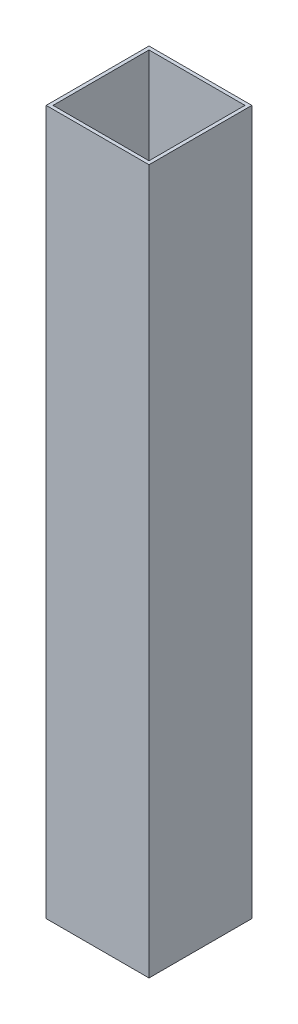
ISO-10303-21;
HEADER;
FILE_DESCRIPTION(('STEP AP214'),'2;1');
FILE_NAME('part.step','',(''),(''),'','','');
FILE_SCHEMA(('AUTOMOTIVE_DESIGN { 1 0 10303 214 1 1 1 1 }'));
ENDSEC;
DATA;
#1=APPLICATION_CONTEXT('core data for automotive mechanical design processes');
#2=APPLICATION_PROTOCOL_DEFINITION('international standard','automotive_design',2000,#1);
#3=PRODUCT_CONTEXT('',#1,'mechanical');
#4=PRODUCT('Part','Part','',(#3));
#5=PRODUCT_RELATED_PRODUCT_CATEGORY('part','',(#4));
#6=PRODUCT_DEFINITION_FORMATION('','',#4);
#7=PRODUCT_DEFINITION_CONTEXT('part definition',#1,'design');
#8=PRODUCT_DEFINITION('design','',#6,#7);
#9=PRODUCT_DEFINITION_SHAPE('','',#8);
#10=(LENGTH_UNIT() NAMED_UNIT(*) SI_UNIT(.MILLI.,.METRE.));
#11=(NAMED_UNIT(*) PLANE_ANGLE_UNIT() SI_UNIT($,.RADIAN.));
#12=(NAMED_UNIT(*) SI_UNIT($,.STERADIAN.) SOLID_ANGLE_UNIT());
#13=UNCERTAINTY_MEASURE_WITH_UNIT(LENGTH_MEASURE(1.E-05),#10,'distance_accuracy_value','');
#14=(GEOMETRIC_REPRESENTATION_CONTEXT(3) GLOBAL_UNCERTAINTY_ASSIGNED_CONTEXT((#13)) GLOBAL_UNIT_ASSIGNED_CONTEXT((#10,
#11,#12)) REPRESENTATION_CONTEXT('',''));
#15=CARTESIAN_POINT('',(0.,0.,0.));
#16=DIRECTION('',(0.,0.,1.));
#17=DIRECTION('',(1.,0.,0.));
#18=AXIS2_PLACEMENT_3D('',#15,#16,#17);
#19=CARTESIAN_POINT('',(0.,440.,-30.));
#20=DIRECTION('',(0.,1.,0.));
#21=DIRECTION('',(0.,0.,1.));
#22=AXIS2_PLACEMENT_3D('',#19,#20,#21);
#23=PLANE('',#22);
#24=DIRECTION('',(0.,0.,1.));
#25=VECTOR('',#24,1.);
#26=CARTESIAN_POINT('',(29.0000000000002,440.,0.));
#27=LINE('',#26,#25);
#28=CARTESIAN_POINT('',(29.0000000000002,440.,0.));
#29=VERTEX_POINT('',#28);
#30=CARTESIAN_POINT('',(29.0000000000002,440.,60.));
#31=VERTEX_POINT('',#30);
#32=EDGE_CURVE('E110',#29,#31,#27,.T.);
#33=ORIENTED_EDGE('',*,*,#32,.F.);
#34=DIRECTION('',(1.,0.,0.));
#35=VECTOR('',#34,1.);
#36=CARTESIAN_POINT('',(-30.9999999999998,440.,0.));
#37=LINE('',#36,#35);
#38=CARTESIAN_POINT('',(-30.9999999999998,440.,0.));
#39=VERTEX_POINT('',#38);
#40=EDGE_CURVE('E139',#39,#29,#37,.T.);
#41=ORIENTED_EDGE('',*,*,#40,.F.);
#42=DIRECTION('',(0.,0.,-1.));
#43=VECTOR('',#42,1.);
#44=CARTESIAN_POINT('',(-30.9999999999998,440.,0.));
#45=LINE('',#44,#43);
#46=CARTESIAN_POINT('',(-30.9999999999998,440.,60.));
#47=VERTEX_POINT('',#46);
#48=EDGE_CURVE('E134',#47,#39,#45,.T.);
#49=ORIENTED_EDGE('',*,*,#48,.F.);
#50=DIRECTION('',(-1.,0.,0.));
#51=VECTOR('',#50,1.);
#52=CARTESIAN_POINT('',(-30.9999999999998,440.,60.));
#53=LINE('',#52,#51);
#54=EDGE_CURVE('E129',#31,#47,#53,.T.);
#55=ORIENTED_EDGE('',*,*,#54,.F.);
#56=EDGE_LOOP('',(#33,#41,#49,#55));
#57=FACE_BOUND('',#56,.T.);
#58=DIRECTION('',(0.,0.,1.));
#59=VECTOR('',#58,1.);
#60=CARTESIAN_POINT('',(27.0000000000002,440.,2.00000000000002));
#61=LINE('',#60,#59);
#62=CARTESIAN_POINT('',(27.0000000000002,440.,2.00000000000002));
#63=VERTEX_POINT('',#62);
#64=CARTESIAN_POINT('',(27.0000000000002,440.,58.));
#65=VERTEX_POINT('',#64);
#66=EDGE_CURVE('E74',#63,#65,#61,.T.);
#67=ORIENTED_EDGE('',*,*,#66,.T.);
#68=DIRECTION('',(-1.,0.,0.));
#69=VECTOR('',#68,1.);
#70=CARTESIAN_POINT('',(-28.9999999999998,440.,58.));
#71=LINE('',#70,#69);
#72=CARTESIAN_POINT('',(-28.9999999999998,440.,58.));
#73=VERTEX_POINT('',#72);
#74=EDGE_CURVE('E76',#65,#73,#71,.T.);
#75=ORIENTED_EDGE('',*,*,#74,.T.);
#76=DIRECTION('',(0.,0.,-1.));
#77=VECTOR('',#76,1.);
#78=CARTESIAN_POINT('',(-28.9999999999998,440.,2.00000000000002));
#79=LINE('',#78,#77);
#80=CARTESIAN_POINT('',(-28.9999999999998,440.,2.00000000000002));
#81=VERTEX_POINT('',#80);
#82=EDGE_CURVE('E94',#73,#81,#79,.T.);
#83=ORIENTED_EDGE('',*,*,#82,.T.);
#84=DIRECTION('',(1.,0.,0.));
#85=VECTOR('',#84,1.);
#86=CARTESIAN_POINT('',(-28.9999999999998,440.,2.00000000000002));
#87=LINE('',#86,#85);
#88=EDGE_CURVE('E78',#81,#63,#87,.T.);
#89=ORIENTED_EDGE('',*,*,#88,.T.);
#90=EDGE_LOOP('',(#67,#75,#83,#89));
#91=FACE_BOUND('',#90,.T.);
#92=ADVANCED_FACE('F19',(#57,#91),#23,.T.);
#93=CARTESIAN_POINT('',(29.0000000000002,-440.,0.));
#94=DIRECTION('',(-1.,0.,0.));
#95=DIRECTION('',(0.,0.,1.));
#96=AXIS2_PLACEMENT_3D('',#93,#94,#95);
#97=PLANE('',#96);
#98=ORIENTED_EDGE('',*,*,#32,.T.);
#99=DIRECTION('',(0.,1.,0.));
#100=VECTOR('',#99,1.);
#101=CARTESIAN_POINT('',(29.0000000000002,-440.,60.));
#102=LINE('',#101,#100);
#103=CARTESIAN_POINT('',(29.0000000000002,29.0000000000001,60.));
#104=VERTEX_POINT('',#103);
#105=EDGE_CURVE('E131',#104,#31,#102,.T.);
#106=ORIENTED_EDGE('',*,*,#105,.F.);
#107=DIRECTION('',(0.,0.,-1.));
#108=VECTOR('',#107,1.);
#109=CARTESIAN_POINT('',(29.0000000000002,29.0000000000001,0.));
#110=LINE('',#109,#108);
#111=CARTESIAN_POINT('',(29.0000000000002,29.0000000000001,0.));
#112=VERTEX_POINT('',#111);
#113=EDGE_CURVE('E130',#104,#112,#110,.T.);
#114=ORIENTED_EDGE('',*,*,#113,.T.);
#115=DIRECTION('',(0.,1.,0.));
#116=VECTOR('',#115,1.);
#117=CARTESIAN_POINT('',(29.0000000000002,-440.,0.));
#118=LINE('',#117,#116);
#119=EDGE_CURVE('E125',#112,#29,#118,.T.);
#120=ORIENTED_EDGE('',*,*,#119,.T.);
#121=EDGE_LOOP('',(#98,#106,#114,#120));
#122=FACE_BOUND('',#121,.T.);
#123=ADVANCED_FACE('F181',(#122),#97,.F.);
#124=CARTESIAN_POINT('',(-30.9999999999998,-440.,60.));
#125=DIRECTION('',(0.,0.,-1.));
#126=DIRECTION('',(-1.,0.,0.));
#127=AXIS2_PLACEMENT_3D('',#124,#125,#126);
#128=PLANE('',#127);
#129=ORIENTED_EDGE('',*,*,#54,.T.);
#130=DIRECTION('',(0.,1.,0.));
#131=VECTOR('',#130,1.);
#132=CARTESIAN_POINT('',(-30.9999999999998,-440.,60.));
#133=LINE('',#132,#131);
#134=CARTESIAN_POINT('',(-30.9999999999998,29.0000000000001,60.));
#135=VERTEX_POINT('',#134);
#136=EDGE_CURVE('E136',#135,#47,#133,.T.);
#137=ORIENTED_EDGE('',*,*,#136,.F.);
#138=DIRECTION('',(1.,0.,0.));
#139=VECTOR('',#138,1.);
#140=CARTESIAN_POINT('',(-30.9999999999998,29.0000000000001,60.));
#141=LINE('',#140,#139);
#142=EDGE_CURVE('E135',#135,#104,#141,.T.);
#143=ORIENTED_EDGE('',*,*,#142,.T.);
#144=ORIENTED_EDGE('',*,*,#105,.T.);
#145=EDGE_LOOP('',(#129,#137,#143,#144));
#146=FACE_BOUND('',#145,.T.);
#147=ADVANCED_FACE('F176',(#146),#128,.F.);
#148=CARTESIAN_POINT('',(-30.9999999999998,-440.,0.));
#149=DIRECTION('',(1.,0.,0.));
#150=DIRECTION('',(0.,0.,-1.));
#151=AXIS2_PLACEMENT_3D('',#148,#149,#150);
#152=PLANE('',#151);
#153=ORIENTED_EDGE('',*,*,#48,.T.);
#154=DIRECTION('',(0.,1.,0.));
#155=VECTOR('',#154,1.);
#156=CARTESIAN_POINT('',(-30.9999999999998,-440.,0.));
#157=LINE('',#156,#155);
#158=CARTESIAN_POINT('',(-30.9999999999998,29.0000000000001,0.));
#159=VERTEX_POINT('',#158);
#160=EDGE_CURVE('E23',#159,#39,#157,.T.);
#161=ORIENTED_EDGE('',*,*,#160,.F.);
#162=DIRECTION('',(0.,0.,1.));
#163=VECTOR('',#162,1.);
#164=CARTESIAN_POINT('',(-30.9999999999998,29.0000000000001,0.));
#165=LINE('',#164,#163);
#166=EDGE_CURVE('E140',#159,#135,#165,.T.);
#167=ORIENTED_EDGE('',*,*,#166,.T.);
#168=ORIENTED_EDGE('',*,*,#136,.T.);
#169=EDGE_LOOP('',(#153,#161,#167,#168));
#170=FACE_BOUND('',#169,.T.);
#171=ADVANCED_FACE('F190',(#170),#152,.F.);
#172=CARTESIAN_POINT('',(-30.9999999999998,-440.,0.));
#173=DIRECTION('',(0.,0.,1.));
#174=DIRECTION('',(1.,0.,0.));
#175=AXIS2_PLACEMENT_3D('',#172,#173,#174);
#176=PLANE('',#175);
#177=ORIENTED_EDGE('',*,*,#40,.T.);
#178=ORIENTED_EDGE('',*,*,#119,.F.);
#179=DIRECTION('',(-1.,0.,0.));
#180=VECTOR('',#179,1.);
#181=CARTESIAN_POINT('',(-30.9999999999998,29.0000000000001,0.));
#182=LINE('',#181,#180);
#183=EDGE_CURVE('E39',#112,#159,#182,.T.);
#184=ORIENTED_EDGE('',*,*,#183,.T.);
#185=ORIENTED_EDGE('',*,*,#160,.T.);
#186=EDGE_LOOP('',(#177,#178,#184,#185));
#187=FACE_BOUND('',#186,.T.);
#188=ADVANCED_FACE('F194',(#187),#176,.F.);
#189=CARTESIAN_POINT('',(1.11022302462516E-13,29.0000000000001,30.));
#190=DIRECTION('',(0.,1.,0.));
#191=DIRECTION('',(-1.,0.,0.));
#192=AXIS2_PLACEMENT_3D('',#189,#190,#191);
#193=PLANE('',#192);
#194=DIRECTION('',(1.,0.,0.));
#195=VECTOR('',#194,1.);
#196=CARTESIAN_POINT('',(-28.9999999999998,29.0000000000001,58.));
#197=LINE('',#196,#195);
#198=CARTESIAN_POINT('',(-28.9999999999998,29.0000000000001,58.));
#199=VERTEX_POINT('',#198);
#200=CARTESIAN_POINT('',(27.0000000000002,29.0000000000001,58.));
#201=VERTEX_POINT('',#200);
#202=EDGE_CURVE('E163',#199,#201,#197,.T.);
#203=ORIENTED_EDGE('',*,*,#202,.T.);
#204=DIRECTION('',(0.,0.,-1.));
#205=VECTOR('',#204,1.);
#206=CARTESIAN_POINT('',(27.0000000000002,29.0000000000001,2.00000000000002));
#207=LINE('',#206,#205);
#208=CARTESIAN_POINT('',(27.0000000000002,29.0000000000001,2.00000000000002));
#209=VERTEX_POINT('',#208);
#210=EDGE_CURVE('E97',#201,#209,#207,.T.);
#211=ORIENTED_EDGE('',*,*,#210,.T.);
#212=DIRECTION('',(-1.,0.,0.));
#213=VECTOR('',#212,1.);
#214=CARTESIAN_POINT('',(-28.9999999999998,29.0000000000001,2.00000000000002));
#215=LINE('',#214,#213);
#216=CARTESIAN_POINT('',(-28.9999999999998,29.0000000000001,2.00000000000002));
#217=VERTEX_POINT('',#216);
#218=EDGE_CURVE('E106',#209,#217,#215,.T.);
#219=ORIENTED_EDGE('',*,*,#218,.T.);
#220=DIRECTION('',(0.,0.,1.));
#221=VECTOR('',#220,1.);
#222=CARTESIAN_POINT('',(-28.9999999999998,29.0000000000001,2.00000000000002));
#223=LINE('',#222,#221);
#224=EDGE_CURVE('E100',#217,#199,#223,.T.);
#225=ORIENTED_EDGE('',*,*,#224,.T.);
#226=EDGE_LOOP('',(#203,#211,#219,#225));
#227=FACE_BOUND('',#226,.T.);
#228=ORIENTED_EDGE('',*,*,#113,.F.);
#229=ORIENTED_EDGE('',*,*,#142,.F.);
#230=ORIENTED_EDGE('',*,*,#166,.F.);
#231=ORIENTED_EDGE('',*,*,#183,.F.);
#232=EDGE_LOOP('',(#228,#229,#230,#231));
#233=FACE_BOUND('',#232,.T.);
#234=ADVANCED_FACE('F207',(#227,#233),#193,.F.);
#235=CARTESIAN_POINT('',(27.0000000000002,-440.,2.00000000000002));
#236=DIRECTION('',(-1.,0.,0.));
#237=DIRECTION('',(0.,0.,1.));
#238=AXIS2_PLACEMENT_3D('',#235,#236,#237);
#239=PLANE('',#238);
#240=DIRECTION('',(0.,1.,0.));
#241=VECTOR('',#240,1.);
#242=CARTESIAN_POINT('',(27.0000000000002,-440.,58.));
#243=LINE('',#242,#241);
#244=EDGE_CURVE('E89',#201,#65,#243,.T.);
#245=ORIENTED_EDGE('',*,*,#244,.T.);
#246=ORIENTED_EDGE('',*,*,#66,.F.);
#247=DIRECTION('',(0.,1.,0.));
#248=VECTOR('',#247,1.);
#249=CARTESIAN_POINT('',(27.0000000000002,-440.,2.00000000000002));
#250=LINE('',#249,#248);
#251=EDGE_CURVE('E99',#209,#63,#250,.T.);
#252=ORIENTED_EDGE('',*,*,#251,.F.);
#253=ORIENTED_EDGE('',*,*,#210,.F.);
#254=EDGE_LOOP('',(#245,#246,#252,#253));
#255=FACE_BOUND('',#254,.T.);
#256=ADVANCED_FACE('F96',(#255),#239,.T.);
#257=CARTESIAN_POINT('',(-28.9999999999998,-440.,2.00000000000002));
#258=DIRECTION('',(0.,0.,1.));
#259=DIRECTION('',(1.,0.,0.));
#260=AXIS2_PLACEMENT_3D('',#257,#258,#259);
#261=PLANE('',#260);
#262=ORIENTED_EDGE('',*,*,#251,.T.);
#263=ORIENTED_EDGE('',*,*,#88,.F.);
#264=DIRECTION('',(0.,1.,0.));
#265=VECTOR('',#264,1.);
#266=CARTESIAN_POINT('',(-28.9999999999998,-440.,2.00000000000002));
#267=LINE('',#266,#265);
#268=EDGE_CURVE('E30',#217,#81,#267,.T.);
#269=ORIENTED_EDGE('',*,*,#268,.F.);
#270=ORIENTED_EDGE('',*,*,#218,.F.);
#271=EDGE_LOOP('',(#262,#263,#269,#270));
#272=FACE_BOUND('',#271,.T.);
#273=ADVANCED_FACE('F213',(#272),#261,.T.);
#274=CARTESIAN_POINT('',(-28.9999999999998,-440.,2.00000000000002));
#275=DIRECTION('',(1.,0.,0.));
#276=DIRECTION('',(0.,0.,-1.));
#277=AXIS2_PLACEMENT_3D('',#274,#275,#276);
#278=PLANE('',#277);
#279=ORIENTED_EDGE('',*,*,#268,.T.);
#280=ORIENTED_EDGE('',*,*,#82,.F.);
#281=DIRECTION('',(0.,1.,0.));
#282=VECTOR('',#281,1.);
#283=CARTESIAN_POINT('',(-28.9999999999998,-440.,58.));
#284=LINE('',#283,#282);
#285=EDGE_CURVE('E12',#199,#73,#284,.T.);
#286=ORIENTED_EDGE('',*,*,#285,.F.);
#287=ORIENTED_EDGE('',*,*,#224,.F.);
#288=EDGE_LOOP('',(#279,#280,#286,#287));
#289=FACE_BOUND('',#288,.T.);
#290=ADVANCED_FACE('F212',(#289),#278,.T.);
#291=CARTESIAN_POINT('',(-28.9999999999998,-440.,58.));
#292=DIRECTION('',(0.,0.,-1.));
#293=DIRECTION('',(-1.,0.,0.));
#294=AXIS2_PLACEMENT_3D('',#291,#292,#293);
#295=PLANE('',#294);
#296=ORIENTED_EDGE('',*,*,#285,.T.);
#297=ORIENTED_EDGE('',*,*,#74,.F.);
#298=ORIENTED_EDGE('',*,*,#244,.F.);
#299=ORIENTED_EDGE('',*,*,#202,.F.);
#300=EDGE_LOOP('',(#296,#297,#298,#299));
#301=FACE_BOUND('',#300,.T.);
#302=ADVANCED_FACE('F87',(#301),#295,.T.);
#303=CLOSED_SHELL('',(#92,#123,#147,#171,#188,#234,#256,#273,#290,#302));
#304=MANIFOLD_SOLID_BREP('B1',#303);
#305=ADVANCED_BREP_SHAPE_REPRESENTATION('',(#18,#304),#14);
#306=SHAPE_DEFINITION_REPRESENTATION(#9,#305);
ENDSEC;
END-ISO-10303-21;
